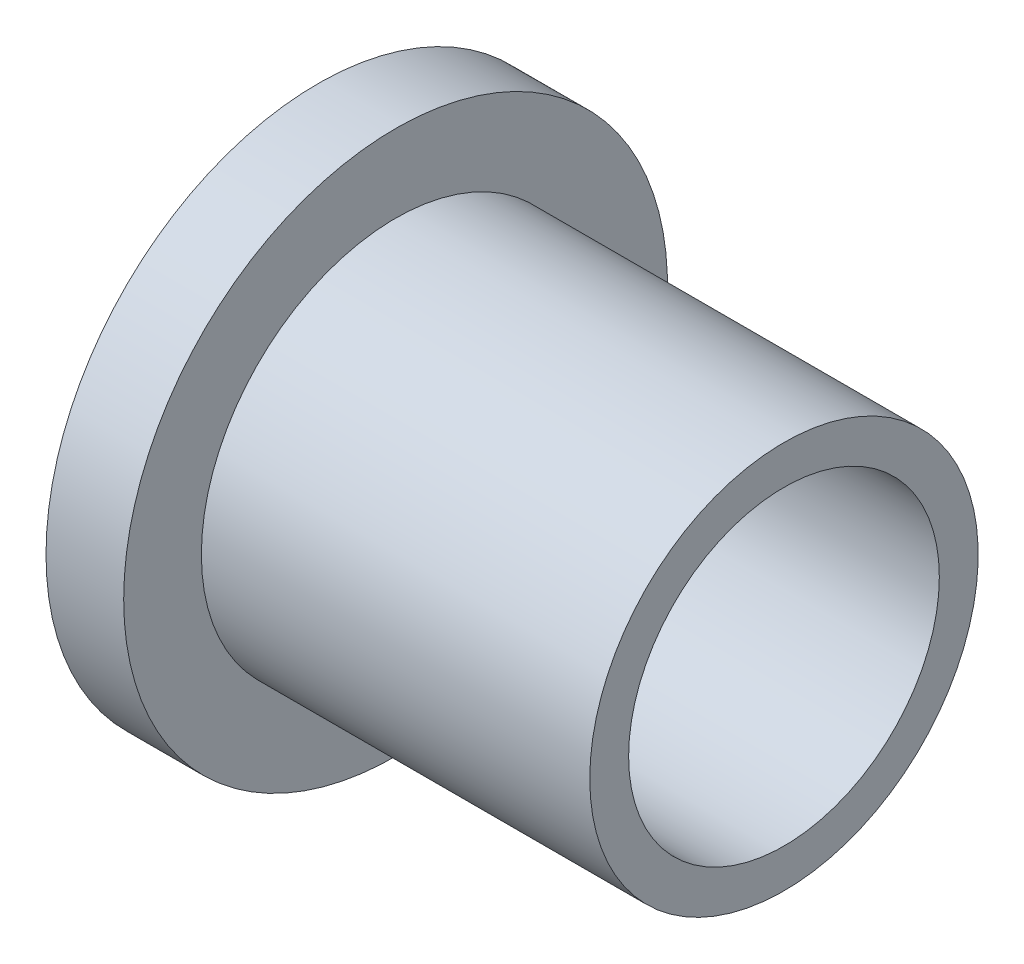
ISO-10303-21;
HEADER;
FILE_DESCRIPTION(('STEP AP214'),'2;1');
FILE_NAME('part.step','',(''),(''),'','','');
FILE_SCHEMA(('AUTOMOTIVE_DESIGN { 1 0 10303 214 1 1 1 1 }'));
ENDSEC;
DATA;
#1=APPLICATION_CONTEXT('core data for automotive mechanical design processes');
#2=APPLICATION_PROTOCOL_DEFINITION('international standard','automotive_design',2000,#1);
#3=PRODUCT_CONTEXT('',#1,'mechanical');
#4=PRODUCT('Part','Part','',(#3));
#5=PRODUCT_RELATED_PRODUCT_CATEGORY('part','',(#4));
#6=PRODUCT_DEFINITION_FORMATION('','',#4);
#7=PRODUCT_DEFINITION_CONTEXT('part definition',#1,'design');
#8=PRODUCT_DEFINITION('design','',#6,#7);
#9=PRODUCT_DEFINITION_SHAPE('','',#8);
#10=(LENGTH_UNIT() NAMED_UNIT(*) SI_UNIT(.MILLI.,.METRE.));
#11=(NAMED_UNIT(*) PLANE_ANGLE_UNIT() SI_UNIT($,.RADIAN.));
#12=(NAMED_UNIT(*) SI_UNIT($,.STERADIAN.) SOLID_ANGLE_UNIT());
#13=UNCERTAINTY_MEASURE_WITH_UNIT(LENGTH_MEASURE(1.E-05),#10,'distance_accuracy_value','');
#14=(GEOMETRIC_REPRESENTATION_CONTEXT(3) GLOBAL_UNCERTAINTY_ASSIGNED_CONTEXT((#13)) GLOBAL_UNIT_ASSIGNED_CONTEXT((#10,
#11,#12)) REPRESENTATION_CONTEXT('',''));
#15=CARTESIAN_POINT('',(0.,0.,0.));
#16=DIRECTION('',(0.,0.,1.));
#17=DIRECTION('',(1.,0.,0.));
#18=AXIS2_PLACEMENT_3D('',#15,#16,#17);
#19=CARTESIAN_POINT('',(19.05,0.,0.));
#20=DIRECTION('',(-1.,0.,0.));
#21=DIRECTION('',(0.,0.,1.));
#22=AXIS2_PLACEMENT_3D('',#19,#20,#21);
#23=CYLINDRICAL_SURFACE('',#22,7.9375);
#24=CARTESIAN_POINT('',(19.05,0.,0.));
#25=DIRECTION('',(1.,0.,0.));
#26=DIRECTION('',(0.,0.,-1.));
#27=AXIS2_PLACEMENT_3D('',#24,#25,#26);
#28=CIRCLE('',#27,7.9375);
#29=CARTESIAN_POINT('',(19.05,0.,7.9375));
#30=VERTEX_POINT('',#29);
#31=EDGE_CURVE('E39',#30,#30,#28,.T.);
#32=CARTESIAN_POINT('',(3.175,0.,0.));
#33=DIRECTION('',(-1.,0.,0.));
#34=DIRECTION('',(0.,0.,1.));
#35=AXIS2_PLACEMENT_3D('',#32,#33,#34);
#36=CIRCLE('',#35,7.9375);
#37=CARTESIAN_POINT('',(3.175,0.,7.9375));
#38=VERTEX_POINT('',#37);
#39=EDGE_CURVE('E10',#38,#38,#36,.T.);
#40=CARTESIAN_POINT('',(19.05,0.,7.9375));
#41=CARTESIAN_POINT('',(18.8846354166667,0.,7.9375));
#42=CARTESIAN_POINT('',(18.7192708333333,0.,7.9375));
#43=CARTESIAN_POINT('',(18.3885416666667,0.,7.9375));
#44=CARTESIAN_POINT('',(18.2231770833333,0.,7.9375));
#45=CARTESIAN_POINT('',(17.8924479166667,0.,7.9375));
#46=CARTESIAN_POINT('',(17.7270833333333,0.,7.9375));
#47=CARTESIAN_POINT('',(17.3963541666667,0.,7.9375));
#48=CARTESIAN_POINT('',(17.2309895833333,0.,7.9375));
#49=CARTESIAN_POINT('',(16.9002604166667,0.,7.9375));
#50=CARTESIAN_POINT('',(16.7348958333333,0.,7.9375));
#51=CARTESIAN_POINT('',(16.4041666666667,0.,7.9375));
#52=CARTESIAN_POINT('',(16.2388020833333,0.,7.9375));
#53=CARTESIAN_POINT('',(15.9080729166667,0.,7.9375));
#54=CARTESIAN_POINT('',(15.7427083333333,0.,7.9375));
#55=CARTESIAN_POINT('',(15.4119791666667,0.,7.9375));
#56=CARTESIAN_POINT('',(15.2466145833333,0.,7.9375));
#57=CARTESIAN_POINT('',(14.9158854166667,0.,7.9375));
#58=CARTESIAN_POINT('',(14.7505208333333,0.,7.9375));
#59=CARTESIAN_POINT('',(14.4197916666667,0.,7.9375));
#60=CARTESIAN_POINT('',(14.2544270833333,0.,7.9375));
#61=CARTESIAN_POINT('',(13.9236979166667,0.,7.9375));
#62=CARTESIAN_POINT('',(13.7583333333333,0.,7.9375));
#63=CARTESIAN_POINT('',(13.4276041666667,0.,7.9375));
#64=CARTESIAN_POINT('',(13.2622395833333,0.,7.9375));
#65=CARTESIAN_POINT('',(12.9315104166667,0.,7.9375));
#66=CARTESIAN_POINT('',(12.7661458333333,0.,7.9375));
#67=CARTESIAN_POINT('',(12.4354166666667,0.,7.9375));
#68=CARTESIAN_POINT('',(12.2700520833333,0.,7.9375));
#69=CARTESIAN_POINT('',(11.9393229166667,0.,7.9375));
#70=CARTESIAN_POINT('',(11.7739583333333,0.,7.9375));
#71=CARTESIAN_POINT('',(11.4432291666667,0.,7.9375));
#72=CARTESIAN_POINT('',(11.2778645833333,0.,7.9375));
#73=CARTESIAN_POINT('',(10.9471354166667,0.,7.9375));
#74=CARTESIAN_POINT('',(10.7817708333333,0.,7.9375));
#75=CARTESIAN_POINT('',(10.4510416666667,0.,7.9375));
#76=CARTESIAN_POINT('',(10.2856770833333,0.,7.9375));
#77=CARTESIAN_POINT('',(9.95494791666667,0.,7.9375));
#78=CARTESIAN_POINT('',(9.78958333333333,0.,7.9375));
#79=CARTESIAN_POINT('',(9.45885416666667,0.,7.9375));
#80=CARTESIAN_POINT('',(9.29348958333333,0.,7.9375));
#81=CARTESIAN_POINT('',(8.96276041666667,0.,7.9375));
#82=CARTESIAN_POINT('',(8.79739583333333,0.,7.9375));
#83=CARTESIAN_POINT('',(8.46666666666667,0.,7.9375));
#84=CARTESIAN_POINT('',(8.30130208333333,0.,7.9375));
#85=CARTESIAN_POINT('',(7.97057291666667,0.,7.9375));
#86=CARTESIAN_POINT('',(7.80520833333333,0.,7.9375));
#87=CARTESIAN_POINT('',(7.47447916666667,0.,7.9375));
#88=CARTESIAN_POINT('',(7.30911458333333,0.,7.9375));
#89=CARTESIAN_POINT('',(6.97838541666667,0.,7.9375));
#90=CARTESIAN_POINT('',(6.81302083333333,0.,7.9375));
#91=CARTESIAN_POINT('',(6.48229166666667,0.,7.9375));
#92=CARTESIAN_POINT('',(6.31692708333333,0.,7.9375));
#93=CARTESIAN_POINT('',(5.98619791666667,0.,7.9375));
#94=CARTESIAN_POINT('',(5.82083333333333,0.,7.9375));
#95=CARTESIAN_POINT('',(5.49010416666667,0.,7.9375));
#96=CARTESIAN_POINT('',(5.32473958333333,0.,7.9375));
#97=CARTESIAN_POINT('',(4.99401041666667,0.,7.9375));
#98=CARTESIAN_POINT('',(4.82864583333333,0.,7.9375));
#99=CARTESIAN_POINT('',(4.49791666666667,0.,7.9375));
#100=CARTESIAN_POINT('',(4.33255208333333,0.,7.9375));
#101=CARTESIAN_POINT('',(4.00182291666667,0.,7.9375));
#102=CARTESIAN_POINT('',(3.83645833333333,0.,7.9375));
#103=CARTESIAN_POINT('',(3.50572916666667,0.,7.9375));
#104=CARTESIAN_POINT('',(3.34036458333334,0.,7.9375));
#105=CARTESIAN_POINT('',(3.175,0.,7.9375));
#106=B_SPLINE_CURVE_WITH_KNOTS('',3,(#40,#41,#42,#43,#44,#45,#46,#47,#48,#49,#50,#51,#52,#53,
#54,#55,#56,#57,#58,#59,#60,#61,#62,#63,#64,#65,#66,#67,#68,#69,#70,#71,#72,#73,#74,#75,#76,#77,
#78,#79,#80,#81,#82,#83,#84,#85,#86,#87,#88,#89,#90,#91,#92,#93,#94,#95,#96,#97,#98,#99,#100,
#101,#102,#103,#104,#105),.UNSPECIFIED.,.F.,.F.,(4,2,2,2,2,2,2,2,2,2,2,2,2,2,2,2,2,2,2,2,2,2,2,
2,2,2,2,2,2,2,2,2,4),(0.,0.496093750000003,0.992187500000002,1.48828125,1.984375,2.48046875,
2.9765625,3.47265625,3.96875,4.46484375,4.9609375,5.45703125,5.953125,6.44921875,6.9453125,
7.44140625,7.9375,8.43359375,8.9296875,9.42578125,9.921875,10.41796875,10.9140625,11.41015625,
11.90625,12.40234375,12.8984375,13.39453125,13.890625,14.38671875,14.8828125,15.37890625,
15.875),.UNSPECIFIED.);
#107=EDGE_CURVE('BSEAM33',#30,#38,#106,.T.);
#108=ORIENTED_EDGE('',*,*,#31,.F.);
#109=ORIENTED_EDGE('',*,*,#39,.F.);
#110=ORIENTED_EDGE('',*,*,#107,.T.);
#111=ORIENTED_EDGE('',*,*,#107,.F.);
#112=EDGE_LOOP('',(#108,#110,#109,#111));
#113=FACE_BOUND('',#112,.T.);
#114=ADVANCED_FACE('F33',(#113),#23,.T.);
#115=CARTESIAN_POINT('',(19.05,0.,0.));
#116=DIRECTION('',(1.,0.,0.));
#117=DIRECTION('',(0.,0.,-1.));
#118=AXIS2_PLACEMENT_3D('',#115,#116,#117);
#119=PLANE('',#118);
#120=ORIENTED_EDGE('',*,*,#31,.T.);
#121=EDGE_LOOP('',(#120));
#122=FACE_BOUND('',#121,.T.);
#123=CARTESIAN_POINT('',(19.05,0.,0.));
#124=DIRECTION('',(1.,0.,0.));
#125=DIRECTION('',(0.,0.,-1.));
#126=AXIS2_PLACEMENT_3D('',#123,#124,#125);
#127=CIRCLE('',#126,6.35);
#128=CARTESIAN_POINT('',(19.05,0.,6.35));
#129=VERTEX_POINT('',#128);
#130=EDGE_CURVE('E43',#129,#129,#127,.T.);
#131=ORIENTED_EDGE('',*,*,#130,.F.);
#132=EDGE_LOOP('',(#131));
#133=FACE_BOUND('',#132,.T.);
#134=ADVANCED_FACE('F71',(#122,#133),#119,.T.);
#135=CARTESIAN_POINT('',(0.,0.,0.));
#136=DIRECTION('',(1.,0.,0.));
#137=DIRECTION('',(0.,0.,-1.));
#138=AXIS2_PLACEMENT_3D('',#135,#136,#137);
#139=PLANE('',#138);
#140=CARTESIAN_POINT('',(0.,0.,0.));
#141=DIRECTION('',(1.,0.,0.));
#142=DIRECTION('',(0.,0.,-1.));
#143=AXIS2_PLACEMENT_3D('',#140,#141,#142);
#144=CIRCLE('',#143,6.35);
#145=CARTESIAN_POINT('',(0.,0.,6.35));
#146=VERTEX_POINT('',#145);
#147=EDGE_CURVE('E47',#146,#146,#144,.T.);
#148=ORIENTED_EDGE('',*,*,#147,.T.);
#149=EDGE_LOOP('',(#148));
#150=FACE_BOUND('',#149,.T.);
#151=CARTESIAN_POINT('',(0.,0.,0.));
#152=DIRECTION('',(-1.,0.,0.));
#153=DIRECTION('',(0.,0.,1.));
#154=AXIS2_PLACEMENT_3D('',#151,#152,#153);
#155=CIRCLE('',#154,11.1125);
#156=CARTESIAN_POINT('',(0.,0.,11.1125));
#157=VERTEX_POINT('',#156);
#158=EDGE_CURVE('E53',#157,#157,#155,.T.);
#159=ORIENTED_EDGE('',*,*,#158,.T.);
#160=EDGE_LOOP('',(#159));
#161=FACE_BOUND('',#160,.T.);
#162=ADVANCED_FACE('F76',(#150,#161),#139,.F.);
#163=CARTESIAN_POINT('',(19.05,0.,0.));
#164=DIRECTION('',(-1.,0.,0.));
#165=DIRECTION('',(0.,0.,1.));
#166=AXIS2_PLACEMENT_3D('',#163,#164,#165);
#167=CYLINDRICAL_SURFACE('',#166,6.35);
#168=CARTESIAN_POINT('',(19.05,0.,6.35));
#169=CARTESIAN_POINT('',(18.8515625,0.,6.35));
#170=CARTESIAN_POINT('',(18.653125,0.,6.35));
#171=CARTESIAN_POINT('',(18.25625,0.,6.35));
#172=CARTESIAN_POINT('',(18.0578125,0.,6.35));
#173=CARTESIAN_POINT('',(17.6609375,0.,6.35));
#174=CARTESIAN_POINT('',(17.4625,0.,6.35));
#175=CARTESIAN_POINT('',(17.065625,0.,6.35));
#176=CARTESIAN_POINT('',(16.8671875,0.,6.35));
#177=CARTESIAN_POINT('',(16.4703125,0.,6.35));
#178=CARTESIAN_POINT('',(16.271875,0.,6.35));
#179=CARTESIAN_POINT('',(15.875,0.,6.35));
#180=CARTESIAN_POINT('',(15.6765625,0.,6.35));
#181=CARTESIAN_POINT('',(15.2796875,0.,6.35));
#182=CARTESIAN_POINT('',(15.08125,0.,6.35));
#183=CARTESIAN_POINT('',(14.684375,0.,6.35));
#184=CARTESIAN_POINT('',(14.4859375,0.,6.35));
#185=CARTESIAN_POINT('',(14.0890625,0.,6.35));
#186=CARTESIAN_POINT('',(13.890625,0.,6.35));
#187=CARTESIAN_POINT('',(13.49375,0.,6.35));
#188=CARTESIAN_POINT('',(13.2953125,0.,6.35));
#189=CARTESIAN_POINT('',(12.8984375,0.,6.35));
#190=CARTESIAN_POINT('',(12.7,0.,6.35));
#191=CARTESIAN_POINT('',(12.303125,0.,6.35));
#192=CARTESIAN_POINT('',(12.1046875,0.,6.35));
#193=CARTESIAN_POINT('',(11.7078125,0.,6.35));
#194=CARTESIAN_POINT('',(11.509375,0.,6.35));
#195=CARTESIAN_POINT('',(11.1125,0.,6.35));
#196=CARTESIAN_POINT('',(10.9140625,0.,6.35));
#197=CARTESIAN_POINT('',(10.5171875,0.,6.35));
#198=CARTESIAN_POINT('',(10.31875,0.,6.35));
#199=CARTESIAN_POINT('',(9.921875,0.,6.35));
#200=CARTESIAN_POINT('',(9.7234375,0.,6.35));
#201=CARTESIAN_POINT('',(9.3265625,0.,6.35));
#202=CARTESIAN_POINT('',(9.128125,0.,6.35));
#203=CARTESIAN_POINT('',(8.73125,0.,6.35));
#204=CARTESIAN_POINT('',(8.5328125,0.,6.35));
#205=CARTESIAN_POINT('',(8.1359375,0.,6.35));
#206=CARTESIAN_POINT('',(7.9375,0.,6.35));
#207=CARTESIAN_POINT('',(7.540625,0.,6.35));
#208=CARTESIAN_POINT('',(7.3421875,0.,6.35));
#209=CARTESIAN_POINT('',(6.9453125,0.,6.35));
#210=CARTESIAN_POINT('',(6.746875,0.,6.35));
#211=CARTESIAN_POINT('',(6.35,0.,6.35));
#212=CARTESIAN_POINT('',(6.1515625,0.,6.35));
#213=CARTESIAN_POINT('',(5.7546875,0.,6.35));
#214=CARTESIAN_POINT('',(5.55625,0.,6.35));
#215=CARTESIAN_POINT('',(5.159375,0.,6.35));
#216=CARTESIAN_POINT('',(4.9609375,0.,6.35));
#217=CARTESIAN_POINT('',(4.5640625,0.,6.35));
#218=CARTESIAN_POINT('',(4.365625,0.,6.35));
#219=CARTESIAN_POINT('',(3.96875,0.,6.35));
#220=CARTESIAN_POINT('',(3.7703125,0.,6.35));
#221=CARTESIAN_POINT('',(3.3734375,0.,6.35));
#222=CARTESIAN_POINT('',(3.175,0.,6.35));
#223=CARTESIAN_POINT('',(2.778125,0.,6.35));
#224=CARTESIAN_POINT('',(2.5796875,0.,6.35));
#225=CARTESIAN_POINT('',(2.1828125,0.,6.35));
#226=CARTESIAN_POINT('',(1.984375,0.,6.35));
#227=CARTESIAN_POINT('',(1.5875,0.,6.35));
#228=CARTESIAN_POINT('',(1.3890625,0.,6.35));
#229=CARTESIAN_POINT('',(0.992187500000001,0.,6.35));
#230=CARTESIAN_POINT('',(0.793750000000001,0.,6.35));
#231=CARTESIAN_POINT('',(0.396875,0.,6.35));
#232=CARTESIAN_POINT('',(0.1984375,0.,6.35));
#233=CARTESIAN_POINT('',(0.,0.,6.35));
#234=B_SPLINE_CURVE_WITH_KNOTS('',3,(#168,#169,#170,#171,#172,#173,#174,#175,#176,#177,#178,
#179,#180,#181,#182,#183,#184,#185,#186,#187,#188,#189,#190,#191,#192,#193,#194,#195,#196,#197,
#198,#199,#200,#201,#202,#203,#204,#205,#206,#207,#208,#209,#210,#211,#212,#213,#214,#215,#216,
#217,#218,#219,#220,#221,#222,#223,#224,#225,#226,#227,#228,#229,#230,#231,#232,#233),
.UNSPECIFIED.,.F.,.F.,(4,2,2,2,2,2,2,2,2,2,2,2,2,2,2,2,2,2,2,2,2,2,2,2,2,2,2,2,2,2,2,2,4),(0.,
0.5953125,1.190625,1.7859375,2.38125,2.9765625,3.571875,4.1671875,4.7625,5.3578125,5.953125,
6.5484375,7.14375,7.7390625,8.334375,8.9296875,9.525,10.1203125,10.715625,11.3109375,11.90625,
12.5015625,13.096875,13.6921875,14.2875,14.8828125,15.478125,16.0734375,16.66875,17.2640625,
17.859375,18.4546875,19.05),.UNSPECIFIED.);
#235=EDGE_CURVE('BSEAM68',#129,#146,#234,.T.);
#236=ORIENTED_EDGE('',*,*,#130,.T.);
#237=ORIENTED_EDGE('',*,*,#147,.F.);
#238=ORIENTED_EDGE('',*,*,#235,.T.);
#239=ORIENTED_EDGE('',*,*,#235,.F.);
#240=EDGE_LOOP('',(#236,#238,#237,#239));
#241=FACE_BOUND('',#240,.T.);
#242=ADVANCED_FACE('F68',(#241),#167,.F.);
#243=CARTESIAN_POINT('',(3.175,0.,0.));
#244=DIRECTION('',(-1.,0.,0.));
#245=DIRECTION('',(0.,0.,1.));
#246=AXIS2_PLACEMENT_3D('',#243,#244,#245);
#247=CYLINDRICAL_SURFACE('',#246,11.1125);
#248=CARTESIAN_POINT('',(3.175,0.,0.));
#249=DIRECTION('',(-1.,0.,0.));
#250=DIRECTION('',(0.,0.,1.));
#251=AXIS2_PLACEMENT_3D('',#248,#249,#250);
#252=CIRCLE('',#251,11.1125);
#253=CARTESIAN_POINT('',(3.175,0.,11.1125));
#254=VERTEX_POINT('',#253);
#255=EDGE_CURVE('E51',#254,#254,#252,.T.);
#256=ORIENTED_EDGE('',*,*,#255,.T.);
#257=EDGE_LOOP('',(#256));
#258=FACE_BOUND('',#257,.T.);
#259=ORIENTED_EDGE('',*,*,#158,.F.);
#260=EDGE_LOOP('',(#259));
#261=FACE_BOUND('',#260,.T.);
#262=ADVANCED_FACE('F59',(#258,#261),#247,.T.);
#263=CARTESIAN_POINT('',(3.175,0.,0.));
#264=DIRECTION('',(-1.,0.,0.));
#265=DIRECTION('',(0.,0.,1.));
#266=AXIS2_PLACEMENT_3D('',#263,#264,#265);
#267=PLANE('',#266);
#268=ORIENTED_EDGE('',*,*,#39,.T.);
#269=EDGE_LOOP('',(#268));
#270=FACE_BOUND('',#269,.T.);
#271=ORIENTED_EDGE('',*,*,#255,.F.);
#272=EDGE_LOOP('',(#271));
#273=FACE_BOUND('',#272,.T.);
#274=ADVANCED_FACE('F62',(#270,#273),#267,.F.);
#275=CLOSED_SHELL('',(#114,#134,#162,#242,#262,#274));
#276=MANIFOLD_SOLID_BREP('B2',#275);
#277=ADVANCED_BREP_SHAPE_REPRESENTATION('',(#18,#276),#14);
#278=SHAPE_DEFINITION_REPRESENTATION(#9,#277);
ENDSEC;
END-ISO-10303-21;
